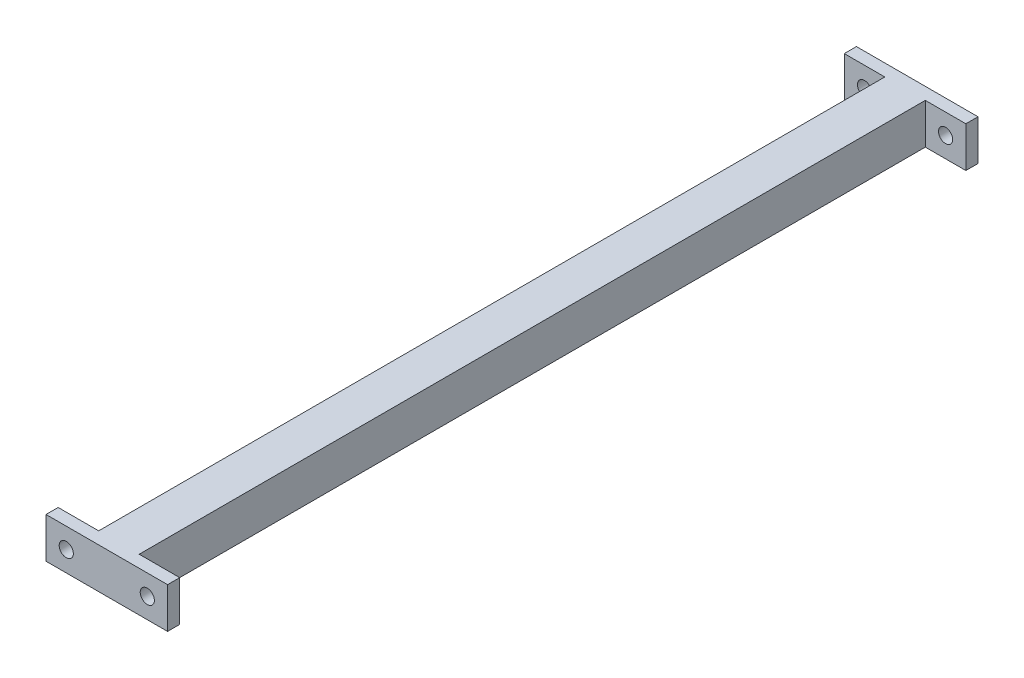
ISO-10303-21;
HEADER;
FILE_DESCRIPTION(('STEP AP214'),'2;1');
FILE_NAME('part.step','',(''),(''),'','','');
FILE_SCHEMA(('AUTOMOTIVE_DESIGN { 1 0 10303 214 1 1 1 1 }'));
ENDSEC;
DATA;
#1=APPLICATION_CONTEXT('core data for automotive mechanical design processes');
#2=APPLICATION_PROTOCOL_DEFINITION('international standard','automotive_design',2000,#1);
#3=PRODUCT_CONTEXT('',#1,'mechanical');
#4=PRODUCT('Part','Part','',(#3));
#5=PRODUCT_RELATED_PRODUCT_CATEGORY('part','',(#4));
#6=PRODUCT_DEFINITION_FORMATION('','',#4);
#7=PRODUCT_DEFINITION_CONTEXT('part definition',#1,'design');
#8=PRODUCT_DEFINITION('design','',#6,#7);
#9=PRODUCT_DEFINITION_SHAPE('','',#8);
#10=(LENGTH_UNIT() NAMED_UNIT(*) SI_UNIT(.MILLI.,.METRE.));
#11=(NAMED_UNIT(*) PLANE_ANGLE_UNIT() SI_UNIT($,.RADIAN.));
#12=(NAMED_UNIT(*) SI_UNIT($,.STERADIAN.) SOLID_ANGLE_UNIT());
#13=UNCERTAINTY_MEASURE_WITH_UNIT(LENGTH_MEASURE(1.E-05),#10,'distance_accuracy_value','');
#14=(GEOMETRIC_REPRESENTATION_CONTEXT(3) GLOBAL_UNCERTAINTY_ASSIGNED_CONTEXT((#13)) GLOBAL_UNIT_ASSIGNED_CONTEXT((#10,
#11,#12)) REPRESENTATION_CONTEXT('',''));
#15=CARTESIAN_POINT('',(0.,0.,0.));
#16=DIRECTION('',(0.,0.,1.));
#17=DIRECTION('',(1.,0.,0.));
#18=AXIS2_PLACEMENT_3D('',#15,#16,#17);
#19=CARTESIAN_POINT('',(-10.,0.,200.));
#20=DIRECTION('',(0.,0.,-1.));
#21=DIRECTION('',(-1.,0.,0.));
#22=AXIS2_PLACEMENT_3D('',#19,#20,#21);
#23=CYLINDRICAL_SURFACE('',#22,1.75);
#24=CARTESIAN_POINT('',(-10.,0.,3.));
#25=DIRECTION('',(0.,0.,-1.));
#26=DIRECTION('',(0.,1.,0.));
#27=AXIS2_PLACEMENT_3D('',#24,#25,#26);
#28=CIRCLE('',#27,1.75);
#29=CARTESIAN_POINT('',(-10.,1.75,3.));
#30=VERTEX_POINT('',#29);
#31=EDGE_CURVE('E224',#30,#30,#28,.F.);
#32=ORIENTED_EDGE('',*,*,#31,.T.);
#33=EDGE_LOOP('',(#32));
#34=FACE_BOUND('',#33,.T.);
#35=CARTESIAN_POINT('',(-10.,0.,0.));
#36=DIRECTION('',(0.,0.,-1.));
#37=DIRECTION('',(-1.,0.,0.));
#38=AXIS2_PLACEMENT_3D('',#35,#36,#37);
#39=CIRCLE('',#38,1.75);
#40=CARTESIAN_POINT('',(-11.75,0.,0.));
#41=VERTEX_POINT('',#40);
#42=EDGE_CURVE('E258',#41,#41,#39,.T.);
#43=ORIENTED_EDGE('',*,*,#42,.T.);
#44=EDGE_LOOP('',(#43));
#45=FACE_BOUND('',#44,.T.);
#46=ADVANCED_FACE('F95',(#34,#45),#23,.F.);
#47=CARTESIAN_POINT('',(-15.,5.,200.));
#48=DIRECTION('',(1.,0.,0.));
#49=DIRECTION('',(0.,1.,0.));
#50=AXIS2_PLACEMENT_3D('',#47,#48,#49);
#51=PLANE('',#50);
#52=DIRECTION('',(0.,0.,-1.));
#53=VECTOR('',#52,1.);
#54=CARTESIAN_POINT('',(-15.,-5.,200.));
#55=LINE('',#54,#53);
#56=CARTESIAN_POINT('',(-15.,-5.,3.));
#57=VERTEX_POINT('',#56);
#58=CARTESIAN_POINT('',(-15.,-5.,0.));
#59=VERTEX_POINT('',#58);
#60=EDGE_CURVE('E296',#57,#59,#55,.T.);
#61=ORIENTED_EDGE('',*,*,#60,.F.);
#62=DIRECTION('',(0.,-1.,0.));
#63=VECTOR('',#62,1.);
#64=CARTESIAN_POINT('',(-15.,5.,3.));
#65=LINE('',#64,#63);
#66=CARTESIAN_POINT('',(-15.,5.,3.));
#67=VERTEX_POINT('',#66);
#68=EDGE_CURVE('E191',#67,#57,#65,.T.);
#69=ORIENTED_EDGE('',*,*,#68,.F.);
#70=DIRECTION('',(0.,0.,-1.));
#71=VECTOR('',#70,1.);
#72=CARTESIAN_POINT('',(-15.,5.,200.));
#73=LINE('',#72,#71);
#74=CARTESIAN_POINT('',(-15.,5.,0.));
#75=VERTEX_POINT('',#74);
#76=EDGE_CURVE('E299',#67,#75,#73,.T.);
#77=ORIENTED_EDGE('',*,*,#76,.T.);
#78=DIRECTION('',(0.,-1.,0.));
#79=VECTOR('',#78,1.);
#80=CARTESIAN_POINT('',(-15.,5.,0.));
#81=LINE('',#80,#79);
#82=EDGE_CURVE('E290',#75,#59,#81,.T.);
#83=ORIENTED_EDGE('',*,*,#82,.T.);
#84=EDGE_LOOP('',(#61,#69,#77,#83));
#85=FACE_BOUND('',#84,.T.);
#86=ADVANCED_FACE('F314',(#85),#51,.F.);
#87=CARTESIAN_POINT('',(10.,0.,200.));
#88=DIRECTION('',(0.,0.,-1.));
#89=DIRECTION('',(-1.,0.,0.));
#90=AXIS2_PLACEMENT_3D('',#87,#88,#89);
#91=CYLINDRICAL_SURFACE('',#90,1.75);
#92=CARTESIAN_POINT('',(10.,0.,197.));
#93=DIRECTION('',(0.,0.,1.));
#94=DIRECTION('',(1.,0.,0.));
#95=AXIS2_PLACEMENT_3D('',#92,#93,#94);
#96=CIRCLE('',#95,1.75);
#97=CARTESIAN_POINT('',(11.75,0.,197.));
#98=VERTEX_POINT('',#97);
#99=EDGE_CURVE('E255',#98,#98,#96,.T.);
#100=ORIENTED_EDGE('',*,*,#99,.F.);
#101=EDGE_LOOP('',(#100));
#102=FACE_BOUND('',#101,.T.);
#103=CARTESIAN_POINT('',(10.,0.,200.));
#104=DIRECTION('',(0.,0.,1.));
#105=DIRECTION('',(1.,0.,0.));
#106=AXIS2_PLACEMENT_3D('',#103,#104,#105);
#107=CIRCLE('',#106,1.75);
#108=CARTESIAN_POINT('',(11.75,0.,200.));
#109=VERTEX_POINT('',#108);
#110=EDGE_CURVE('E267',#109,#109,#107,.T.);
#111=ORIENTED_EDGE('',*,*,#110,.T.);
#112=EDGE_LOOP('',(#111));
#113=FACE_BOUND('',#112,.T.);
#114=ADVANCED_FACE('F316',(#102,#113),#91,.F.);
#115=CARTESIAN_POINT('',(15.,5.,200.));
#116=DIRECTION('',(1.,0.,0.));
#117=DIRECTION('',(0.,0.,-1.));
#118=AXIS2_PLACEMENT_3D('',#115,#116,#117);
#119=PLANE('',#118);
#120=DIRECTION('',(0.,-1.,0.));
#121=VECTOR('',#120,1.);
#122=CARTESIAN_POINT('',(15.,5.,197.));
#123=LINE('',#122,#121);
#124=CARTESIAN_POINT('',(15.,5.,197.));
#125=VERTEX_POINT('',#124);
#126=CARTESIAN_POINT('',(15.,-5.,197.));
#127=VERTEX_POINT('',#126);
#128=EDGE_CURVE('E227',#125,#127,#123,.T.);
#129=ORIENTED_EDGE('',*,*,#128,.F.);
#130=DIRECTION('',(0.,0.,-1.));
#131=VECTOR('',#130,1.);
#132=CARTESIAN_POINT('',(15.,5.,200.));
#133=LINE('',#132,#131);
#134=CARTESIAN_POINT('',(15.,5.,200.));
#135=VERTEX_POINT('',#134);
#136=EDGE_CURVE('E281',#135,#125,#133,.T.);
#137=ORIENTED_EDGE('',*,*,#136,.F.);
#138=DIRECTION('',(0.,-1.,0.));
#139=VECTOR('',#138,1.);
#140=CARTESIAN_POINT('',(15.,5.,200.));
#141=LINE('',#140,#139);
#142=CARTESIAN_POINT('',(15.,-5.,200.));
#143=VERTEX_POINT('',#142);
#144=EDGE_CURVE('E275',#135,#143,#141,.T.);
#145=ORIENTED_EDGE('',*,*,#144,.T.);
#146=DIRECTION('',(0.,0.,-1.));
#147=VECTOR('',#146,1.);
#148=CARTESIAN_POINT('',(15.,-5.,200.));
#149=LINE('',#148,#147);
#150=EDGE_CURVE('E264',#143,#127,#149,.T.);
#151=ORIENTED_EDGE('',*,*,#150,.T.);
#152=EDGE_LOOP('',(#129,#137,#145,#151));
#153=FACE_BOUND('',#152,.T.);
#154=ADVANCED_FACE('F322',(#153),#119,.T.);
#155=CARTESIAN_POINT('',(0.,-5.,200.));
#156=DIRECTION('',(0.,1.,0.));
#157=DIRECTION('',(0.,0.,1.));
#158=AXIS2_PLACEMENT_3D('',#155,#156,#157);
#159=PLANE('',#158);
#160=DIRECTION('',(0.,0.,1.));
#161=VECTOR('',#160,1.);
#162=CARTESIAN_POINT('',(-5.,-5.,3.));
#163=LINE('',#162,#161);
#164=CARTESIAN_POINT('',(-5.,-5.,3.));
#165=VERTEX_POINT('',#164);
#166=CARTESIAN_POINT('',(-5.,-5.,197.));
#167=VERTEX_POINT('',#166);
#168=EDGE_CURVE('E201',#165,#167,#163,.T.);
#169=ORIENTED_EDGE('',*,*,#168,.F.);
#170=DIRECTION('',(-1.,0.,0.));
#171=VECTOR('',#170,1.);
#172=CARTESIAN_POINT('',(-5.,-5.,3.));
#173=LINE('',#172,#171);
#174=EDGE_CURVE('E184',#165,#57,#173,.T.);
#175=ORIENTED_EDGE('',*,*,#174,.T.);
#176=ORIENTED_EDGE('',*,*,#60,.T.);
#177=DIRECTION('',(1.,0.,0.));
#178=VECTOR('',#177,1.);
#179=CARTESIAN_POINT('',(0.,-5.,0.));
#180=LINE('',#179,#178);
#181=CARTESIAN_POINT('',(15.,-5.,0.));
#182=VERTEX_POINT('',#181);
#183=EDGE_CURVE('E261',#59,#182,#180,.T.);
#184=ORIENTED_EDGE('',*,*,#183,.T.);
#185=CARTESIAN_POINT('',(15.,-5.,3.));
#186=VERTEX_POINT('',#185);
#187=EDGE_CURVE('E284',#186,#182,#149,.T.);
#188=ORIENTED_EDGE('',*,*,#187,.F.);
#189=DIRECTION('',(1.,0.,0.));
#190=VECTOR('',#189,1.);
#191=CARTESIAN_POINT('',(5.,-5.,3.));
#192=LINE('',#191,#190);
#193=CARTESIAN_POINT('',(5.,-5.,3.));
#194=VERTEX_POINT('',#193);
#195=EDGE_CURVE('E120',#194,#186,#192,.T.);
#196=ORIENTED_EDGE('',*,*,#195,.F.);
#197=DIRECTION('',(0.,0.,-1.));
#198=VECTOR('',#197,1.);
#199=CARTESIAN_POINT('',(5.,-5.,197.));
#200=LINE('',#199,#198);
#201=CARTESIAN_POINT('',(5.,-5.,197.));
#202=VERTEX_POINT('',#201);
#203=EDGE_CURVE('E231',#202,#194,#200,.T.);
#204=ORIENTED_EDGE('',*,*,#203,.F.);
#205=DIRECTION('',(1.,0.,0.));
#206=VECTOR('',#205,1.);
#207=CARTESIAN_POINT('',(5.,-5.,197.));
#208=LINE('',#207,#206);
#209=EDGE_CURVE('E241',#202,#127,#208,.T.);
#210=ORIENTED_EDGE('',*,*,#209,.T.);
#211=ORIENTED_EDGE('',*,*,#150,.F.);
#212=DIRECTION('',(1.,0.,0.));
#213=VECTOR('',#212,1.);
#214=CARTESIAN_POINT('',(0.,-5.,200.));
#215=LINE('',#214,#213);
#216=CARTESIAN_POINT('',(-15.,-5.,200.));
#217=VERTEX_POINT('',#216);
#218=EDGE_CURVE('E104',#217,#143,#215,.T.);
#219=ORIENTED_EDGE('',*,*,#218,.F.);
#220=CARTESIAN_POINT('',(-15.,-5.,197.));
#221=VERTEX_POINT('',#220);
#222=EDGE_CURVE('E99',#217,#221,#55,.T.);
#223=ORIENTED_EDGE('',*,*,#222,.T.);
#224=DIRECTION('',(-1.,0.,0.));
#225=VECTOR('',#224,1.);
#226=CARTESIAN_POINT('',(-5.,-5.,197.));
#227=LINE('',#226,#225);
#228=EDGE_CURVE('E112',#167,#221,#227,.T.);
#229=ORIENTED_EDGE('',*,*,#228,.F.);
#230=EDGE_LOOP('',(#169,#175,#176,#184,#188,#196,#204,#210,#211,#219,#223,#229));
#231=FACE_BOUND('',#230,.T.);
#232=ADVANCED_FACE('F206',(#231),#159,.F.);
#233=CARTESIAN_POINT('',(0.,0.,200.));
#234=DIRECTION('',(0.,0.,1.));
#235=DIRECTION('',(1.,0.,0.));
#236=AXIS2_PLACEMENT_3D('',#233,#234,#235);
#237=PLANE('',#236);
#238=ORIENTED_EDGE('',*,*,#218,.T.);
#239=ORIENTED_EDGE('',*,*,#144,.F.);
#240=DIRECTION('',(1.,0.,0.));
#241=VECTOR('',#240,1.);
#242=CARTESIAN_POINT('',(0.,5.,200.));
#243=LINE('',#242,#241);
#244=CARTESIAN_POINT('',(-15.,5.,200.));
#245=VERTEX_POINT('',#244);
#246=EDGE_CURVE('E12',#245,#135,#243,.T.);
#247=ORIENTED_EDGE('',*,*,#246,.F.);
#248=DIRECTION('',(0.,-1.,0.));
#249=VECTOR('',#248,1.);
#250=CARTESIAN_POINT('',(-15.,5.,200.));
#251=LINE('',#250,#249);
#252=EDGE_CURVE('E293',#245,#217,#251,.T.);
#253=ORIENTED_EDGE('',*,*,#252,.T.);
#254=EDGE_LOOP('',(#238,#239,#247,#253));
#255=FACE_BOUND('',#254,.T.);
#256=CARTESIAN_POINT('',(-10.,0.,200.));
#257=DIRECTION('',(0.,0.,-1.));
#258=DIRECTION('',(-1.,0.,0.));
#259=AXIS2_PLACEMENT_3D('',#256,#257,#258);
#260=CIRCLE('',#259,1.75);
#261=CARTESIAN_POINT('',(-11.75,0.,200.));
#262=VERTEX_POINT('',#261);
#263=EDGE_CURVE('E287',#262,#262,#260,.T.);
#264=ORIENTED_EDGE('',*,*,#263,.T.);
#265=EDGE_LOOP('',(#264));
#266=FACE_BOUND('',#265,.T.);
#267=ORIENTED_EDGE('',*,*,#110,.F.);
#268=EDGE_LOOP('',(#267));
#269=FACE_BOUND('',#268,.T.);
#270=ADVANCED_FACE('F344',(#255,#266,#269),#237,.T.);
#271=CARTESIAN_POINT('',(0.,0.,0.));
#272=DIRECTION('',(0.,0.,1.));
#273=DIRECTION('',(1.,0.,0.));
#274=AXIS2_PLACEMENT_3D('',#271,#272,#273);
#275=PLANE('',#274);
#276=ORIENTED_EDGE('',*,*,#183,.F.);
#277=ORIENTED_EDGE('',*,*,#82,.F.);
#278=DIRECTION('',(1.,0.,0.));
#279=VECTOR('',#278,1.);
#280=CARTESIAN_POINT('',(0.,5.,0.));
#281=LINE('',#280,#279);
#282=CARTESIAN_POINT('',(15.,5.,0.));
#283=VERTEX_POINT('',#282);
#284=EDGE_CURVE('E259',#75,#283,#281,.T.);
#285=ORIENTED_EDGE('',*,*,#284,.T.);
#286=DIRECTION('',(0.,-1.,0.));
#287=VECTOR('',#286,1.);
#288=CARTESIAN_POINT('',(15.,5.,0.));
#289=LINE('',#288,#287);
#290=EDGE_CURVE('E270',#283,#182,#289,.T.);
#291=ORIENTED_EDGE('',*,*,#290,.T.);
#292=EDGE_LOOP('',(#276,#277,#285,#291));
#293=FACE_BOUND('',#292,.T.);
#294=ORIENTED_EDGE('',*,*,#42,.F.);
#295=EDGE_LOOP('',(#294));
#296=FACE_BOUND('',#295,.T.);
#297=CARTESIAN_POINT('',(10.,0.,0.));
#298=DIRECTION('',(0.,0.,1.));
#299=DIRECTION('',(1.,0.,0.));
#300=AXIS2_PLACEMENT_3D('',#297,#298,#299);
#301=CIRCLE('',#300,1.75);
#302=CARTESIAN_POINT('',(11.75,0.,0.));
#303=VERTEX_POINT('',#302);
#304=EDGE_CURVE('E271',#303,#303,#301,.T.);
#305=ORIENTED_EDGE('',*,*,#304,.T.);
#306=EDGE_LOOP('',(#305));
#307=FACE_BOUND('',#306,.T.);
#308=ADVANCED_FACE('F311',(#293,#296,#307),#275,.F.);
#309=CARTESIAN_POINT('',(0.,5.,200.));
#310=DIRECTION('',(0.,1.,0.));
#311=DIRECTION('',(0.,0.,1.));
#312=AXIS2_PLACEMENT_3D('',#309,#310,#311);
#313=PLANE('',#312);
#314=DIRECTION('',(-1.,0.,0.));
#315=VECTOR('',#314,1.);
#316=CARTESIAN_POINT('',(-5.,5.,3.));
#317=LINE('',#316,#315);
#318=CARTESIAN_POINT('',(-5.,5.,3.));
#319=VERTEX_POINT('',#318);
#320=EDGE_CURVE('E215',#319,#67,#317,.T.);
#321=ORIENTED_EDGE('',*,*,#320,.F.);
#322=DIRECTION('',(0.,0.,-1.));
#323=VECTOR('',#322,1.);
#324=CARTESIAN_POINT('',(-5.,5.,3.));
#325=LINE('',#324,#323);
#326=CARTESIAN_POINT('',(-5.,5.,197.));
#327=VERTEX_POINT('',#326);
#328=EDGE_CURVE('E195',#327,#319,#325,.T.);
#329=ORIENTED_EDGE('',*,*,#328,.F.);
#330=DIRECTION('',(-1.,0.,0.));
#331=VECTOR('',#330,1.);
#332=CARTESIAN_POINT('',(-5.,5.,197.));
#333=LINE('',#332,#331);
#334=CARTESIAN_POINT('',(-15.,5.,197.));
#335=VERTEX_POINT('',#334);
#336=EDGE_CURVE('E218',#327,#335,#333,.T.);
#337=ORIENTED_EDGE('',*,*,#336,.T.);
#338=EDGE_CURVE('E274',#245,#335,#73,.T.);
#339=ORIENTED_EDGE('',*,*,#338,.F.);
#340=ORIENTED_EDGE('',*,*,#246,.T.);
#341=ORIENTED_EDGE('',*,*,#136,.T.);
#342=DIRECTION('',(1.,0.,0.));
#343=VECTOR('',#342,1.);
#344=CARTESIAN_POINT('',(5.,5.,197.));
#345=LINE('',#344,#343);
#346=CARTESIAN_POINT('',(5.,5.,197.));
#347=VERTEX_POINT('',#346);
#348=EDGE_CURVE('E244',#347,#125,#345,.T.);
#349=ORIENTED_EDGE('',*,*,#348,.F.);
#350=DIRECTION('',(0.,0.,1.));
#351=VECTOR('',#350,1.);
#352=CARTESIAN_POINT('',(5.,5.,197.));
#353=LINE('',#352,#351);
#354=CARTESIAN_POINT('',(5.,5.,3.));
#355=VERTEX_POINT('',#354);
#356=EDGE_CURVE('E238',#355,#347,#353,.T.);
#357=ORIENTED_EDGE('',*,*,#356,.F.);
#358=DIRECTION('',(1.,0.,0.));
#359=VECTOR('',#358,1.);
#360=CARTESIAN_POINT('',(5.,5.,3.));
#361=LINE('',#360,#359);
#362=CARTESIAN_POINT('',(15.,5.,3.));
#363=VERTEX_POINT('',#362);
#364=EDGE_CURVE('E247',#355,#363,#361,.T.);
#365=ORIENTED_EDGE('',*,*,#364,.T.);
#366=EDGE_CURVE('E278',#363,#283,#133,.T.);
#367=ORIENTED_EDGE('',*,*,#366,.T.);
#368=ORIENTED_EDGE('',*,*,#284,.F.);
#369=ORIENTED_EDGE('',*,*,#76,.F.);
#370=EDGE_LOOP('',(#321,#329,#337,#339,#340,#341,#349,#357,#365,#367,#368,#369));
#371=FACE_BOUND('',#370,.T.);
#372=ADVANCED_FACE('F337',(#371),#313,.T.);
#373=CARTESIAN_POINT('',(-10.,0.,197.));
#374=DIRECTION('',(0.,0.,1.));
#375=DIRECTION('',(1.,0.,0.));
#376=AXIS2_PLACEMENT_3D('',#373,#374,#375);
#377=CIRCLE('',#376,1.75);
#378=CARTESIAN_POINT('',(-8.25,0.,197.));
#379=VERTEX_POINT('',#378);
#380=EDGE_CURVE('E217',#379,#379,#377,.F.);
#381=ORIENTED_EDGE('',*,*,#380,.T.);
#382=EDGE_LOOP('',(#381));
#383=FACE_BOUND('',#382,.T.);
#384=ORIENTED_EDGE('',*,*,#263,.F.);
#385=EDGE_LOOP('',(#384));
#386=FACE_BOUND('',#385,.T.);
#387=ADVANCED_FACE('F327',(#383,#386),#23,.F.);
#388=ORIENTED_EDGE('',*,*,#338,.T.);
#389=DIRECTION('',(0.,1.,0.));
#390=VECTOR('',#389,1.);
#391=CARTESIAN_POINT('',(-15.,5.,197.));
#392=LINE('',#391,#390);
#393=EDGE_CURVE('E204',#221,#335,#392,.T.);
#394=ORIENTED_EDGE('',*,*,#393,.F.);
#395=ORIENTED_EDGE('',*,*,#222,.F.);
#396=ORIENTED_EDGE('',*,*,#252,.F.);
#397=EDGE_LOOP('',(#388,#394,#395,#396));
#398=FACE_BOUND('',#397,.T.);
#399=ADVANCED_FACE('F97',(#398),#51,.F.);
#400=CARTESIAN_POINT('',(10.,0.,3.));
#401=DIRECTION('',(0.,0.,-1.));
#402=DIRECTION('',(-1.,0.,0.));
#403=AXIS2_PLACEMENT_3D('',#400,#401,#402);
#404=CIRCLE('',#403,1.75);
#405=CARTESIAN_POINT('',(8.25,0.,3.));
#406=VERTEX_POINT('',#405);
#407=EDGE_CURVE('E246',#406,#406,#404,.T.);
#408=ORIENTED_EDGE('',*,*,#407,.F.);
#409=EDGE_LOOP('',(#408));
#410=FACE_BOUND('',#409,.T.);
#411=ORIENTED_EDGE('',*,*,#304,.F.);
#412=EDGE_LOOP('',(#411));
#413=FACE_BOUND('',#412,.T.);
#414=ADVANCED_FACE('F325',(#410,#413),#91,.F.);
#415=DIRECTION('',(0.,1.,0.));
#416=VECTOR('',#415,1.);
#417=CARTESIAN_POINT('',(15.,5.,3.));
#418=LINE('',#417,#416);
#419=EDGE_CURVE('E232',#186,#363,#418,.T.);
#420=ORIENTED_EDGE('',*,*,#419,.F.);
#421=ORIENTED_EDGE('',*,*,#187,.T.);
#422=ORIENTED_EDGE('',*,*,#290,.F.);
#423=ORIENTED_EDGE('',*,*,#366,.F.);
#424=EDGE_LOOP('',(#420,#421,#422,#423));
#425=FACE_BOUND('',#424,.T.);
#426=ADVANCED_FACE('F334',(#425),#119,.T.);
#427=CARTESIAN_POINT('',(5.,5.,197.));
#428=DIRECTION('',(0.,0.,1.));
#429=DIRECTION('',(1.,0.,0.));
#430=AXIS2_PLACEMENT_3D('',#427,#428,#429);
#431=PLANE('',#430);
#432=ORIENTED_EDGE('',*,*,#99,.T.);
#433=EDGE_LOOP('',(#432));
#434=FACE_BOUND('',#433,.T.);
#435=ORIENTED_EDGE('',*,*,#128,.T.);
#436=ORIENTED_EDGE('',*,*,#209,.F.);
#437=DIRECTION('',(0.,-1.,0.));
#438=VECTOR('',#437,1.);
#439=CARTESIAN_POINT('',(5.,5.,197.));
#440=LINE('',#439,#438);
#441=EDGE_CURVE('E228',#347,#202,#440,.T.);
#442=ORIENTED_EDGE('',*,*,#441,.F.);
#443=ORIENTED_EDGE('',*,*,#348,.T.);
#444=EDGE_LOOP('',(#435,#436,#442,#443));
#445=FACE_BOUND('',#444,.T.);
#446=ADVANCED_FACE('F336',(#434,#445),#431,.F.);
#447=CARTESIAN_POINT('',(5.,5.,3.));
#448=DIRECTION('',(0.,0.,-1.));
#449=DIRECTION('',(-1.,0.,0.));
#450=AXIS2_PLACEMENT_3D('',#447,#448,#449);
#451=PLANE('',#450);
#452=ORIENTED_EDGE('',*,*,#407,.T.);
#453=EDGE_LOOP('',(#452));
#454=FACE_BOUND('',#453,.T.);
#455=ORIENTED_EDGE('',*,*,#419,.T.);
#456=ORIENTED_EDGE('',*,*,#364,.F.);
#457=DIRECTION('',(0.,1.,0.));
#458=VECTOR('',#457,1.);
#459=CARTESIAN_POINT('',(5.,5.,3.));
#460=LINE('',#459,#458);
#461=EDGE_CURVE('E235',#194,#355,#460,.T.);
#462=ORIENTED_EDGE('',*,*,#461,.F.);
#463=ORIENTED_EDGE('',*,*,#195,.T.);
#464=EDGE_LOOP('',(#455,#456,#462,#463));
#465=FACE_BOUND('',#464,.T.);
#466=ADVANCED_FACE('F352',(#454,#465),#451,.F.);
#467=CARTESIAN_POINT('',(5.,0.,0.));
#468=DIRECTION('',(1.,0.,0.));
#469=DIRECTION('',(0.,0.,-1.));
#470=AXIS2_PLACEMENT_3D('',#467,#468,#469);
#471=PLANE('',#470);
#472=ORIENTED_EDGE('',*,*,#441,.T.);
#473=ORIENTED_EDGE('',*,*,#203,.T.);
#474=ORIENTED_EDGE('',*,*,#461,.T.);
#475=ORIENTED_EDGE('',*,*,#356,.T.);
#476=EDGE_LOOP('',(#472,#473,#474,#475));
#477=FACE_BOUND('',#476,.T.);
#478=ADVANCED_FACE('F368',(#477),#471,.T.);
#479=CARTESIAN_POINT('',(-5.,5.,3.));
#480=DIRECTION('',(0.,0.,-1.));
#481=DIRECTION('',(0.,1.,0.));
#482=AXIS2_PLACEMENT_3D('',#479,#480,#481);
#483=PLANE('',#482);
#484=ORIENTED_EDGE('',*,*,#68,.T.);
#485=ORIENTED_EDGE('',*,*,#174,.F.);
#486=DIRECTION('',(0.,-1.,0.));
#487=VECTOR('',#486,1.);
#488=CARTESIAN_POINT('',(-5.,5.,3.));
#489=LINE('',#488,#487);
#490=EDGE_CURVE('E188',#319,#165,#489,.T.);
#491=ORIENTED_EDGE('',*,*,#490,.F.);
#492=ORIENTED_EDGE('',*,*,#320,.T.);
#493=EDGE_LOOP('',(#484,#485,#491,#492));
#494=FACE_BOUND('',#493,.T.);
#495=ORIENTED_EDGE('',*,*,#31,.F.);
#496=EDGE_LOOP('',(#495));
#497=FACE_BOUND('',#496,.T.);
#498=ADVANCED_FACE('F186',(#494,#497),#483,.F.);
#499=CARTESIAN_POINT('',(-5.,5.,197.));
#500=DIRECTION('',(0.,0.,1.));
#501=DIRECTION('',(1.,0.,0.));
#502=AXIS2_PLACEMENT_3D('',#499,#500,#501);
#503=PLANE('',#502);
#504=ORIENTED_EDGE('',*,*,#393,.T.);
#505=ORIENTED_EDGE('',*,*,#336,.F.);
#506=DIRECTION('',(0.,1.,0.));
#507=VECTOR('',#506,1.);
#508=CARTESIAN_POINT('',(-5.,5.,197.));
#509=LINE('',#508,#507);
#510=EDGE_CURVE('E208',#167,#327,#509,.T.);
#511=ORIENTED_EDGE('',*,*,#510,.F.);
#512=ORIENTED_EDGE('',*,*,#228,.T.);
#513=EDGE_LOOP('',(#504,#505,#511,#512));
#514=FACE_BOUND('',#513,.T.);
#515=ORIENTED_EDGE('',*,*,#380,.F.);
#516=EDGE_LOOP('',(#515));
#517=FACE_BOUND('',#516,.T.);
#518=ADVANCED_FACE('F374',(#514,#517),#503,.F.);
#519=CARTESIAN_POINT('',(-5.,0.,0.));
#520=DIRECTION('',(-1.,0.,0.));
#521=DIRECTION('',(0.,-1.,0.));
#522=AXIS2_PLACEMENT_3D('',#519,#520,#521);
#523=PLANE('',#522);
#524=ORIENTED_EDGE('',*,*,#490,.T.);
#525=ORIENTED_EDGE('',*,*,#168,.T.);
#526=ORIENTED_EDGE('',*,*,#510,.T.);
#527=ORIENTED_EDGE('',*,*,#328,.T.);
#528=EDGE_LOOP('',(#524,#525,#526,#527));
#529=FACE_BOUND('',#528,.T.);
#530=ADVANCED_FACE('F199',(#529),#523,.T.);
#531=CLOSED_SHELL('',(#46,#86,#114,#154,#232,#270,#308,#372,#387,#399,#414,#426,#446,#466,#478,
#498,#518,#530));
#532=MANIFOLD_SOLID_BREP('B2',#531);
#533=ADVANCED_BREP_SHAPE_REPRESENTATION('',(#18,#532),#14);
#534=SHAPE_DEFINITION_REPRESENTATION(#9,#533);
ENDSEC;
END-ISO-10303-21;
